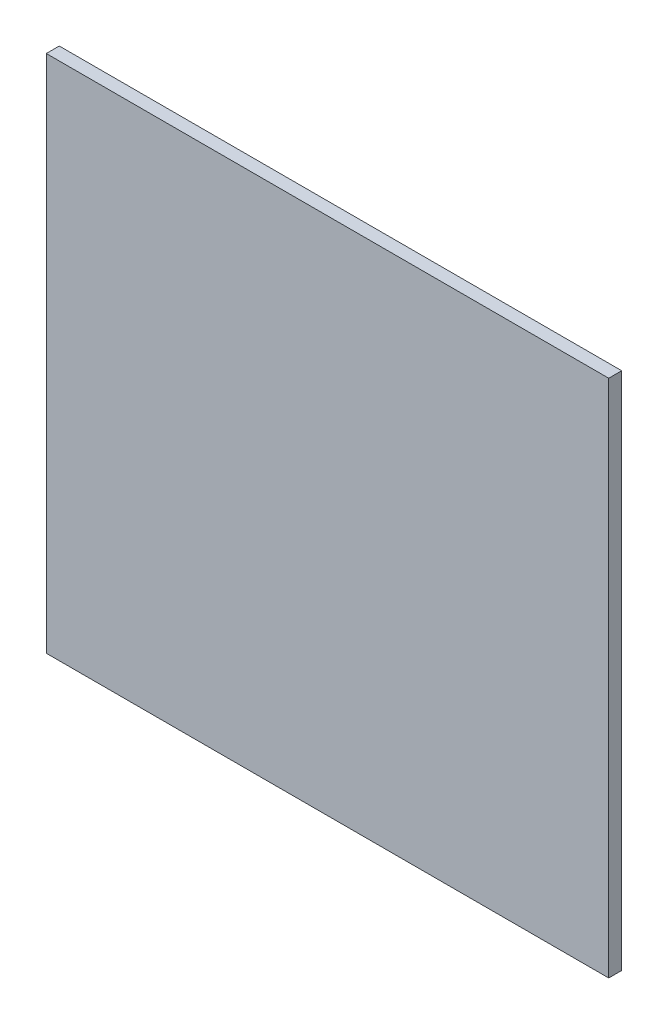
ISO-10303-21;
HEADER;
FILE_DESCRIPTION(('STEP AP214'),'2;1');
FILE_NAME('part.step','',(''),(''),'','','');
FILE_SCHEMA(('AUTOMOTIVE_DESIGN { 1 0 10303 214 1 1 1 1 }'));
ENDSEC;
DATA;
#1=APPLICATION_CONTEXT('core data for automotive mechanical design processes');
#2=APPLICATION_PROTOCOL_DEFINITION('international standard','automotive_design',2000,#1);
#3=PRODUCT_CONTEXT('',#1,'mechanical');
#4=PRODUCT('Part','Part','',(#3));
#5=PRODUCT_RELATED_PRODUCT_CATEGORY('part','',(#4));
#6=PRODUCT_DEFINITION_FORMATION('','',#4);
#7=PRODUCT_DEFINITION_CONTEXT('part definition',#1,'design');
#8=PRODUCT_DEFINITION('design','',#6,#7);
#9=PRODUCT_DEFINITION_SHAPE('','',#8);
#10=(LENGTH_UNIT() NAMED_UNIT(*) SI_UNIT(.MILLI.,.METRE.));
#11=(NAMED_UNIT(*) PLANE_ANGLE_UNIT() SI_UNIT($,.RADIAN.));
#12=(NAMED_UNIT(*) SI_UNIT($,.STERADIAN.) SOLID_ANGLE_UNIT());
#13=UNCERTAINTY_MEASURE_WITH_UNIT(LENGTH_MEASURE(1.E-05),#10,'distance_accuracy_value','');
#14=(GEOMETRIC_REPRESENTATION_CONTEXT(3) GLOBAL_UNCERTAINTY_ASSIGNED_CONTEXT((#13)) GLOBAL_UNIT_ASSIGNED_CONTEXT((#10,
#11,#12)) REPRESENTATION_CONTEXT('',''));
#15=CARTESIAN_POINT('',(0.,0.,0.));
#16=DIRECTION('',(0.,0.,1.));
#17=DIRECTION('',(1.,0.,0.));
#18=AXIS2_PLACEMENT_3D('',#15,#16,#17);
#19=CARTESIAN_POINT('',(68.7578,-63.5,3.175));
#20=DIRECTION('',(-1.,0.,0.));
#21=DIRECTION('',(0.,0.,1.));
#22=AXIS2_PLACEMENT_3D('',#19,#20,#21);
#23=PLANE('',#22);
#24=DIRECTION('',(0.,1.,0.));
#25=VECTOR('',#24,1.);
#26=CARTESIAN_POINT('',(68.7578,-63.5,0.));
#27=LINE('',#26,#25);
#28=CARTESIAN_POINT('',(68.7578,-63.5,0.));
#29=VERTEX_POINT('',#28);
#30=CARTESIAN_POINT('',(68.7578,63.5,0.));
#31=VERTEX_POINT('',#30);
#32=EDGE_CURVE('E96',#29,#31,#27,.T.);
#33=ORIENTED_EDGE('',*,*,#32,.T.);
#34=DIRECTION('',(0.,0.,-1.));
#35=VECTOR('',#34,1.);
#36=CARTESIAN_POINT('',(68.7578,63.5,3.175));
#37=LINE('',#36,#35);
#38=CARTESIAN_POINT('',(68.7578,63.5,3.175));
#39=VERTEX_POINT('',#38);
#40=EDGE_CURVE('E11',#39,#31,#37,.T.);
#41=ORIENTED_EDGE('',*,*,#40,.F.);
#42=DIRECTION('',(0.,1.,0.));
#43=VECTOR('',#42,1.);
#44=CARTESIAN_POINT('',(68.7578,-63.5,3.175));
#45=LINE('',#44,#43);
#46=CARTESIAN_POINT('',(68.7578,-63.5,3.175));
#47=VERTEX_POINT('',#46);
#48=EDGE_CURVE('E84',#47,#39,#45,.T.);
#49=ORIENTED_EDGE('',*,*,#48,.F.);
#50=DIRECTION('',(0.,0.,-1.));
#51=VECTOR('',#50,1.);
#52=CARTESIAN_POINT('',(68.7578,-63.5,3.175));
#53=LINE('',#52,#51);
#54=EDGE_CURVE('E92',#47,#29,#53,.T.);
#55=ORIENTED_EDGE('',*,*,#54,.T.);
#56=EDGE_LOOP('',(#33,#41,#49,#55));
#57=FACE_BOUND('',#56,.T.);
#58=ADVANCED_FACE('F33',(#57),#23,.F.);
#59=CARTESIAN_POINT('',(-68.7578,63.5,3.175));
#60=DIRECTION('',(0.,-1.,0.));
#61=DIRECTION('',(0.,0.,-1.));
#62=AXIS2_PLACEMENT_3D('',#59,#60,#61);
#63=PLANE('',#62);
#64=DIRECTION('',(-1.,0.,0.));
#65=VECTOR('',#64,1.);
#66=CARTESIAN_POINT('',(-68.7578,63.5,0.));
#67=LINE('',#66,#65);
#68=CARTESIAN_POINT('',(-68.7578,63.5,0.));
#69=VERTEX_POINT('',#68);
#70=EDGE_CURVE('E88',#31,#69,#67,.T.);
#71=ORIENTED_EDGE('',*,*,#70,.T.);
#72=DIRECTION('',(0.,0.,-1.));
#73=VECTOR('',#72,1.);
#74=CARTESIAN_POINT('',(-68.7578,63.5,3.175));
#75=LINE('',#74,#73);
#76=CARTESIAN_POINT('',(-68.7578,63.5,3.175));
#77=VERTEX_POINT('',#76);
#78=EDGE_CURVE('E41',#77,#69,#75,.T.);
#79=ORIENTED_EDGE('',*,*,#78,.F.);
#80=DIRECTION('',(-1.,0.,0.));
#81=VECTOR('',#80,1.);
#82=CARTESIAN_POINT('',(-68.7578,63.5,3.175));
#83=LINE('',#82,#81);
#84=EDGE_CURVE('E79',#39,#77,#83,.T.);
#85=ORIENTED_EDGE('',*,*,#84,.F.);
#86=ORIENTED_EDGE('',*,*,#40,.T.);
#87=EDGE_LOOP('',(#71,#79,#85,#86));
#88=FACE_BOUND('',#87,.T.);
#89=ADVANCED_FACE('F87',(#88),#63,.F.);
#90=CARTESIAN_POINT('',(-68.7578,-63.5,3.175));
#91=DIRECTION('',(1.,0.,0.));
#92=DIRECTION('',(0.,0.,-1.));
#93=AXIS2_PLACEMENT_3D('',#90,#91,#92);
#94=PLANE('',#93);
#95=DIRECTION('',(0.,-1.,0.));
#96=VECTOR('',#95,1.);
#97=CARTESIAN_POINT('',(-68.7578,-63.5,0.));
#98=LINE('',#97,#96);
#99=CARTESIAN_POINT('',(-68.7578,-63.5,0.));
#100=VERTEX_POINT('',#99);
#101=EDGE_CURVE('E66',#69,#100,#98,.T.);
#102=ORIENTED_EDGE('',*,*,#101,.T.);
#103=DIRECTION('',(0.,0.,-1.));
#104=VECTOR('',#103,1.);
#105=CARTESIAN_POINT('',(-68.7578,-63.5,3.175));
#106=LINE('',#105,#104);
#107=CARTESIAN_POINT('',(-68.7578,-63.5,3.175));
#108=VERTEX_POINT('',#107);
#109=EDGE_CURVE('E89',#108,#100,#106,.T.);
#110=ORIENTED_EDGE('',*,*,#109,.F.);
#111=DIRECTION('',(0.,-1.,0.));
#112=VECTOR('',#111,1.);
#113=CARTESIAN_POINT('',(-68.7578,-63.5,3.175));
#114=LINE('',#113,#112);
#115=EDGE_CURVE('E82',#77,#108,#114,.T.);
#116=ORIENTED_EDGE('',*,*,#115,.F.);
#117=ORIENTED_EDGE('',*,*,#78,.T.);
#118=EDGE_LOOP('',(#102,#110,#116,#117));
#119=FACE_BOUND('',#118,.T.);
#120=ADVANCED_FACE('F90',(#119),#94,.F.);
#121=CARTESIAN_POINT('',(-68.7578,-63.5,3.175));
#122=DIRECTION('',(0.,1.,0.));
#123=DIRECTION('',(0.,0.,1.));
#124=AXIS2_PLACEMENT_3D('',#121,#122,#123);
#125=PLANE('',#124);
#126=DIRECTION('',(1.,0.,0.));
#127=VECTOR('',#126,1.);
#128=CARTESIAN_POINT('',(-68.7578,-63.5,0.));
#129=LINE('',#128,#127);
#130=EDGE_CURVE('E72',#100,#29,#129,.T.);
#131=ORIENTED_EDGE('',*,*,#130,.T.);
#132=ORIENTED_EDGE('',*,*,#54,.F.);
#133=DIRECTION('',(1.,0.,0.));
#134=VECTOR('',#133,1.);
#135=CARTESIAN_POINT('',(-68.7578,-63.5,3.175));
#136=LINE('',#135,#134);
#137=EDGE_CURVE('E49',#108,#47,#136,.T.);
#138=ORIENTED_EDGE('',*,*,#137,.F.);
#139=ORIENTED_EDGE('',*,*,#109,.T.);
#140=EDGE_LOOP('',(#131,#132,#138,#139));
#141=FACE_BOUND('',#140,.T.);
#142=ADVANCED_FACE('F103',(#141),#125,.F.);
#143=CARTESIAN_POINT('',(0.,0.,3.175));
#144=DIRECTION('',(0.,0.,-1.));
#145=DIRECTION('',(-1.,0.,0.));
#146=AXIS2_PLACEMENT_3D('',#143,#144,#145);
#147=PLANE('',#146);
#148=ORIENTED_EDGE('',*,*,#48,.T.);
#149=ORIENTED_EDGE('',*,*,#84,.T.);
#150=ORIENTED_EDGE('',*,*,#115,.T.);
#151=ORIENTED_EDGE('',*,*,#137,.T.);
#152=EDGE_LOOP('',(#148,#149,#150,#151));
#153=FACE_BOUND('',#152,.T.);
#154=ADVANCED_FACE('F80',(#153),#147,.F.);
#155=CARTESIAN_POINT('',(0.,0.,0.));
#156=DIRECTION('',(0.,0.,-1.));
#157=DIRECTION('',(-1.,0.,0.));
#158=AXIS2_PLACEMENT_3D('',#155,#156,#157);
#159=PLANE('',#158);
#160=ORIENTED_EDGE('',*,*,#32,.F.);
#161=ORIENTED_EDGE('',*,*,#130,.F.);
#162=ORIENTED_EDGE('',*,*,#101,.F.);
#163=ORIENTED_EDGE('',*,*,#70,.F.);
#164=EDGE_LOOP('',(#160,#161,#162,#163));
#165=FACE_BOUND('',#164,.T.);
#166=ADVANCED_FACE('F106',(#165),#159,.T.);
#167=CLOSED_SHELL('',(#58,#89,#120,#142,#154,#166));
#168=MANIFOLD_SOLID_BREP('B2',#167);
#169=ADVANCED_BREP_SHAPE_REPRESENTATION('',(#18,#168),#14);
#170=SHAPE_DEFINITION_REPRESENTATION(#9,#169);
ENDSEC;
END-ISO-10303-21;
